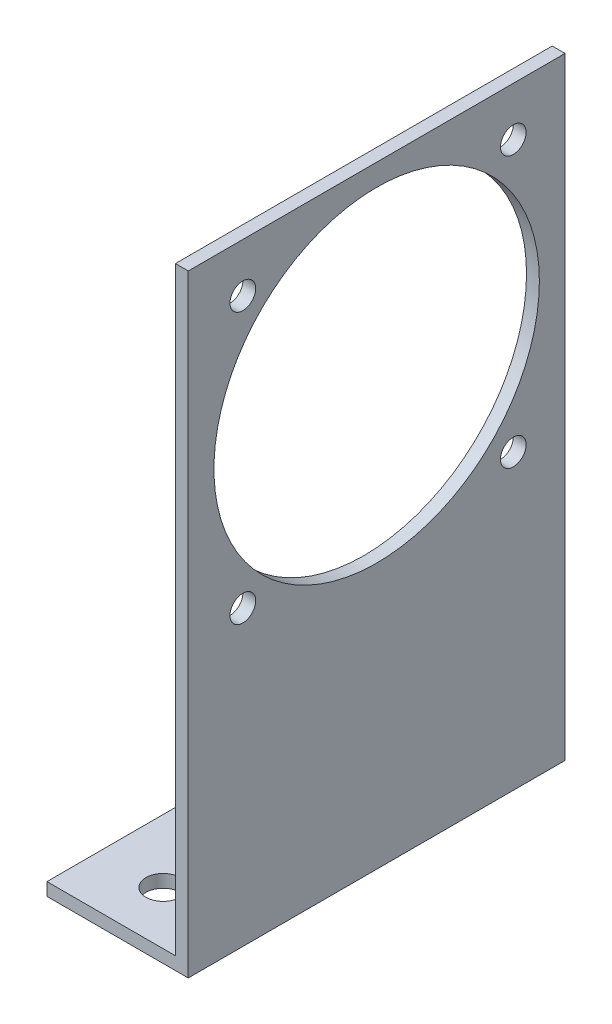
ISO-10303-21;
HEADER;
FILE_DESCRIPTION(('STEP AP214'),'2;1');
FILE_NAME('part.step','',(''),(''),'','','');
FILE_SCHEMA(('AUTOMOTIVE_DESIGN { 1 0 10303 214 1 1 1 1 }'));
ENDSEC;
DATA;
#1=APPLICATION_CONTEXT('core data for automotive mechanical design processes');
#2=APPLICATION_PROTOCOL_DEFINITION('international standard','automotive_design',2000,#1);
#3=PRODUCT_CONTEXT('',#1,'mechanical');
#4=PRODUCT('Part','Part','',(#3));
#5=PRODUCT_RELATED_PRODUCT_CATEGORY('part','',(#4));
#6=PRODUCT_DEFINITION_FORMATION('','',#4);
#7=PRODUCT_DEFINITION_CONTEXT('part definition',#1,'design');
#8=PRODUCT_DEFINITION('design','',#6,#7);
#9=PRODUCT_DEFINITION_SHAPE('','',#8);
#10=(LENGTH_UNIT() NAMED_UNIT(*) SI_UNIT(.MILLI.,.METRE.));
#11=(NAMED_UNIT(*) PLANE_ANGLE_UNIT() SI_UNIT($,.RADIAN.));
#12=(NAMED_UNIT(*) SI_UNIT($,.STERADIAN.) SOLID_ANGLE_UNIT());
#13=UNCERTAINTY_MEASURE_WITH_UNIT(LENGTH_MEASURE(1.E-05),#10,'distance_accuracy_value','');
#14=(GEOMETRIC_REPRESENTATION_CONTEXT(3) GLOBAL_UNCERTAINTY_ASSIGNED_CONTEXT((#13)) GLOBAL_UNIT_ASSIGNED_CONTEXT((#10,
#11,#12)) REPRESENTATION_CONTEXT('',''));
#15=CARTESIAN_POINT('',(0.,0.,0.));
#16=DIRECTION('',(0.,0.,1.));
#17=DIRECTION('',(1.,0.,0.));
#18=AXIS2_PLACEMENT_3D('',#15,#16,#17);
#19=CARTESIAN_POINT('',(16.5,0.,44.));
#20=DIRECTION('',(-1.,0.,0.));
#21=DIRECTION('',(0.,0.,1.));
#22=AXIS2_PLACEMENT_3D('',#19,#20,#21);
#23=PLANE('',#22);
#24=CARTESIAN_POINT('',(16.5,32.7192456794487,6.04403489568548));
#25=DIRECTION('',(1.,0.,0.));
#26=DIRECTION('',(0.,0.,-1.));
#27=AXIS2_PLACEMENT_3D('',#24,#25,#26);
#28=CIRCLE('',#27,1.5);
#29=CARTESIAN_POINT('',(16.5,32.7192456794487,4.54403489568548));
#30=VERTEX_POINT('',#29);
#31=EDGE_CURVE('E157',#30,#30,#28,.T.);
#32=ORIENTED_EDGE('',*,*,#31,.F.);
#33=EDGE_LOOP('',(#32));
#34=FACE_BOUND('',#33,.T.);
#35=CARTESIAN_POINT('',(16.5,32.7192456794487,37.6273925242923));
#36=DIRECTION('',(1.,0.,0.));
#37=DIRECTION('',(0.,0.,-1.));
#38=AXIS2_PLACEMENT_3D('',#35,#36,#37);
#39=CIRCLE('',#38,1.5);
#40=CARTESIAN_POINT('',(16.5,32.7192456794487,36.1273925242923));
#41=VERTEX_POINT('',#40);
#42=EDGE_CURVE('E147',#41,#41,#39,.T.);
#43=ORIENTED_EDGE('',*,*,#42,.F.);
#44=EDGE_LOOP('',(#43));
#45=FACE_BOUND('',#44,.T.);
#46=CARTESIAN_POINT('',(16.5,64.3047188432493,6.04403489568548));
#47=DIRECTION('',(1.,0.,0.));
#48=DIRECTION('',(0.,0.,-1.));
#49=AXIS2_PLACEMENT_3D('',#46,#47,#48);
#50=CIRCLE('',#49,1.5);
#51=CARTESIAN_POINT('',(16.5,64.3047188432493,4.54403489568548));
#52=VERTEX_POINT('',#51);
#53=EDGE_CURVE('E144',#52,#52,#50,.T.);
#54=ORIENTED_EDGE('',*,*,#53,.F.);
#55=EDGE_LOOP('',(#54));
#56=FACE_BOUND('',#55,.T.);
#57=CARTESIAN_POINT('',(16.5,64.3047188432493,37.6273925242923));
#58=DIRECTION('',(1.,0.,0.));
#59=DIRECTION('',(0.,0.,-1.));
#60=AXIS2_PLACEMENT_3D('',#57,#58,#59);
#61=CIRCLE('',#60,1.5);
#62=CARTESIAN_POINT('',(16.5,64.3047188432493,36.1273925242923));
#63=VERTEX_POINT('',#62);
#64=EDGE_CURVE('E141',#63,#63,#61,.T.);
#65=ORIENTED_EDGE('',*,*,#64,.F.);
#66=EDGE_LOOP('',(#65));
#67=FACE_BOUND('',#66,.T.);
#68=CARTESIAN_POINT('',(16.5,48.4593320754999,22.));
#69=DIRECTION('',(1.,0.,0.));
#70=DIRECTION('',(0.,0.,-1.));
#71=AXIS2_PLACEMENT_3D('',#68,#69,#70);
#72=CIRCLE('',#71,19.);
#73=CARTESIAN_POINT('',(16.5,48.4593320754999,3.));
#74=VERTEX_POINT('',#73);
#75=EDGE_CURVE('E136',#74,#74,#72,.T.);
#76=ORIENTED_EDGE('',*,*,#75,.F.);
#77=EDGE_LOOP('',(#76));
#78=FACE_BOUND('',#77,.T.);
#79=DIRECTION('',(0.,1.,0.));
#80=VECTOR('',#79,1.);
#81=CARTESIAN_POINT('',(16.5,0.,0.));
#82=LINE('',#81,#80);
#83=CARTESIAN_POINT('',(16.5,-1.5,0.));
#84=VERTEX_POINT('',#83);
#85=CARTESIAN_POINT('',(16.5,70.,0.));
#86=VERTEX_POINT('',#85);
#87=EDGE_CURVE('E116',#84,#86,#82,.T.);
#88=ORIENTED_EDGE('',*,*,#87,.T.);
#89=DIRECTION('',(0.,0.,-1.));
#90=VECTOR('',#89,1.);
#91=CARTESIAN_POINT('',(16.5,70.,44.));
#92=LINE('',#91,#90);
#93=CARTESIAN_POINT('',(16.5,70.,44.));
#94=VERTEX_POINT('',#93);
#95=EDGE_CURVE('E11',#94,#86,#92,.T.);
#96=ORIENTED_EDGE('',*,*,#95,.F.);
#97=DIRECTION('',(0.,1.,0.));
#98=VECTOR('',#97,1.);
#99=CARTESIAN_POINT('',(16.5,0.,44.));
#100=LINE('',#99,#98);
#101=CARTESIAN_POINT('',(16.5,-1.5,44.));
#102=VERTEX_POINT('',#101);
#103=EDGE_CURVE('E81',#102,#94,#100,.T.);
#104=ORIENTED_EDGE('',*,*,#103,.F.);
#105=DIRECTION('',(0.,0.,-1.));
#106=VECTOR('',#105,1.);
#107=CARTESIAN_POINT('',(16.5,-1.5,44.));
#108=LINE('',#107,#106);
#109=EDGE_CURVE('E112',#102,#84,#108,.T.);
#110=ORIENTED_EDGE('',*,*,#109,.T.);
#111=EDGE_LOOP('',(#88,#96,#104,#110));
#112=FACE_BOUND('',#111,.T.);
#113=ADVANCED_FACE('F33',(#34,#45,#56,#67,#78,#112),#23,.F.);
#114=CARTESIAN_POINT('',(15.,70.,44.));
#115=DIRECTION('',(0.,1.,0.));
#116=DIRECTION('',(0.,0.,1.));
#117=AXIS2_PLACEMENT_3D('',#114,#115,#116);
#118=PLANE('',#117);
#119=DIRECTION('',(1.,0.,0.));
#120=VECTOR('',#119,1.);
#121=CARTESIAN_POINT('',(15.,70.,0.));
#122=LINE('',#121,#120);
#123=CARTESIAN_POINT('',(15.,70.,0.));
#124=VERTEX_POINT('',#123);
#125=EDGE_CURVE('E119',#124,#86,#122,.T.);
#126=ORIENTED_EDGE('',*,*,#125,.F.);
#127=DIRECTION('',(0.,0.,-1.));
#128=VECTOR('',#127,1.);
#129=CARTESIAN_POINT('',(15.,70.,44.));
#130=LINE('',#129,#128);
#131=CARTESIAN_POINT('',(15.,70.,44.));
#132=VERTEX_POINT('',#131);
#133=EDGE_CURVE('E42',#132,#124,#130,.T.);
#134=ORIENTED_EDGE('',*,*,#133,.F.);
#135=DIRECTION('',(1.,0.,0.));
#136=VECTOR('',#135,1.);
#137=CARTESIAN_POINT('',(15.,70.,44.));
#138=LINE('',#137,#136);
#139=EDGE_CURVE('E176',#132,#94,#138,.T.);
#140=ORIENTED_EDGE('',*,*,#139,.T.);
#141=ORIENTED_EDGE('',*,*,#95,.T.);
#142=EDGE_LOOP('',(#126,#134,#140,#141));
#143=FACE_BOUND('',#142,.T.);
#144=ADVANCED_FACE('F199',(#143),#118,.T.);
#145=CARTESIAN_POINT('',(15.,0.,44.));
#146=DIRECTION('',(-1.,0.,0.));
#147=DIRECTION('',(0.,0.,1.));
#148=AXIS2_PLACEMENT_3D('',#145,#146,#147);
#149=PLANE('',#148);
#150=CARTESIAN_POINT('',(15.,32.7192456794487,6.04403489568548));
#151=DIRECTION('',(-1.,0.,0.));
#152=DIRECTION('',(0.,0.,1.));
#153=AXIS2_PLACEMENT_3D('',#150,#151,#152);
#154=CIRCLE('',#153,1.5);
#155=CARTESIAN_POINT('',(15.,32.7192456794487,7.54403489568549));
#156=VERTEX_POINT('',#155);
#157=EDGE_CURVE('E36',#156,#156,#154,.T.);
#158=ORIENTED_EDGE('',*,*,#157,.F.);
#159=EDGE_LOOP('',(#158));
#160=FACE_BOUND('',#159,.T.);
#161=CARTESIAN_POINT('',(15.,32.7192456794487,37.6273925242923));
#162=DIRECTION('',(-1.,0.,0.));
#163=DIRECTION('',(0.,0.,1.));
#164=AXIS2_PLACEMENT_3D('',#161,#162,#163);
#165=CIRCLE('',#164,1.5);
#166=CARTESIAN_POINT('',(15.,32.7192456794487,39.1273925242923));
#167=VERTEX_POINT('',#166);
#168=EDGE_CURVE('E145',#167,#167,#165,.T.);
#169=ORIENTED_EDGE('',*,*,#168,.F.);
#170=EDGE_LOOP('',(#169));
#171=FACE_BOUND('',#170,.T.);
#172=CARTESIAN_POINT('',(15.,64.3047188432493,6.04403489568548));
#173=DIRECTION('',(-1.,0.,0.));
#174=DIRECTION('',(0.,0.,1.));
#175=AXIS2_PLACEMENT_3D('',#172,#173,#174);
#176=CIRCLE('',#175,1.5);
#177=CARTESIAN_POINT('',(15.,64.3047188432493,7.54403489568549));
#178=VERTEX_POINT('',#177);
#179=EDGE_CURVE('E142',#178,#178,#176,.T.);
#180=ORIENTED_EDGE('',*,*,#179,.F.);
#181=EDGE_LOOP('',(#180));
#182=FACE_BOUND('',#181,.T.);
#183=CARTESIAN_POINT('',(15.,64.3047188432493,37.6273925242923));
#184=DIRECTION('',(-1.,0.,0.));
#185=DIRECTION('',(0.,0.,1.));
#186=AXIS2_PLACEMENT_3D('',#183,#184,#185);
#187=CIRCLE('',#186,1.5);
#188=CARTESIAN_POINT('',(15.,64.3047188432493,39.1273925242923));
#189=VERTEX_POINT('',#188);
#190=EDGE_CURVE('E137',#189,#189,#187,.T.);
#191=ORIENTED_EDGE('',*,*,#190,.F.);
#192=EDGE_LOOP('',(#191));
#193=FACE_BOUND('',#192,.T.);
#194=CARTESIAN_POINT('',(15.,48.4593320754999,22.));
#195=DIRECTION('',(-1.,0.,0.));
#196=DIRECTION('',(0.,0.,1.));
#197=AXIS2_PLACEMENT_3D('',#194,#195,#196);
#198=CIRCLE('',#197,19.);
#199=CARTESIAN_POINT('',(15.,48.4593320754999,41.));
#200=VERTEX_POINT('',#199);
#201=EDGE_CURVE('E120',#200,#200,#198,.T.);
#202=ORIENTED_EDGE('',*,*,#201,.F.);
#203=EDGE_LOOP('',(#202));
#204=FACE_BOUND('',#203,.T.);
#205=DIRECTION('',(0.,1.,0.));
#206=VECTOR('',#205,1.);
#207=CARTESIAN_POINT('',(15.,0.,0.));
#208=LINE('',#207,#206);
#209=CARTESIAN_POINT('',(15.,0.,0.));
#210=VERTEX_POINT('',#209);
#211=EDGE_CURVE('E123',#210,#124,#208,.T.);
#212=ORIENTED_EDGE('',*,*,#211,.F.);
#213=DIRECTION('',(0.,0.,-1.));
#214=VECTOR('',#213,1.);
#215=CARTESIAN_POINT('',(15.,0.,44.));
#216=LINE('',#215,#214);
#217=CARTESIAN_POINT('',(15.,0.,44.));
#218=VERTEX_POINT('',#217);
#219=EDGE_CURVE('E102',#218,#210,#216,.T.);
#220=ORIENTED_EDGE('',*,*,#219,.F.);
#221=DIRECTION('',(0.,1.,0.));
#222=VECTOR('',#221,1.);
#223=CARTESIAN_POINT('',(15.,0.,44.));
#224=LINE('',#223,#222);
#225=EDGE_CURVE('E108',#218,#132,#224,.T.);
#226=ORIENTED_EDGE('',*,*,#225,.T.);
#227=ORIENTED_EDGE('',*,*,#133,.T.);
#228=EDGE_LOOP('',(#212,#220,#226,#227));
#229=FACE_BOUND('',#228,.T.);
#230=ADVANCED_FACE('F180',(#160,#171,#182,#193,#204,#229),#149,.T.);
#231=CARTESIAN_POINT('',(0.,0.,44.));
#232=DIRECTION('',(0.,1.,0.));
#233=DIRECTION('',(0.,0.,1.));
#234=AXIS2_PLACEMENT_3D('',#231,#232,#233);
#235=PLANE('',#234);
#236=CARTESIAN_POINT('',(7.37008417365065,0.,37.8086103355978));
#237=DIRECTION('',(0.,1.,0.));
#238=DIRECTION('',(0.,0.,1.));
#239=AXIS2_PLACEMENT_3D('',#236,#237,#238);
#240=CIRCLE('',#239,2.);
#241=CARTESIAN_POINT('',(7.37008417365065,0.,39.8086103355978));
#242=VERTEX_POINT('',#241);
#243=EDGE_CURVE('E140',#242,#242,#240,.T.);
#244=ORIENTED_EDGE('',*,*,#243,.F.);
#245=EDGE_LOOP('',(#244));
#246=FACE_BOUND('',#245,.T.);
#247=CARTESIAN_POINT('',(7.37008417365065,0.,6.19138966440223));
#248=DIRECTION('',(0.,1.,0.));
#249=DIRECTION('',(0.,0.,1.));
#250=AXIS2_PLACEMENT_3D('',#247,#248,#249);
#251=CIRCLE('',#250,2.);
#252=CARTESIAN_POINT('',(7.37008417365065,0.,8.19138966440222));
#253=VERTEX_POINT('',#252);
#254=EDGE_CURVE('E165',#253,#253,#251,.T.);
#255=ORIENTED_EDGE('',*,*,#254,.F.);
#256=EDGE_LOOP('',(#255));
#257=FACE_BOUND('',#256,.T.);
#258=DIRECTION('',(1.,0.,0.));
#259=VECTOR('',#258,1.);
#260=CARTESIAN_POINT('',(0.,0.,0.));
#261=LINE('',#260,#259);
#262=CARTESIAN_POINT('',(0.,0.,0.));
#263=VERTEX_POINT('',#262);
#264=EDGE_CURVE('E97',#263,#210,#261,.T.);
#265=ORIENTED_EDGE('',*,*,#264,.F.);
#266=DIRECTION('',(0.,0.,-1.));
#267=VECTOR('',#266,1.);
#268=CARTESIAN_POINT('',(0.,0.,44.));
#269=LINE('',#268,#267);
#270=CARTESIAN_POINT('',(0.,0.,44.));
#271=VERTEX_POINT('',#270);
#272=EDGE_CURVE('E92',#271,#263,#269,.T.);
#273=ORIENTED_EDGE('',*,*,#272,.F.);
#274=DIRECTION('',(1.,0.,0.));
#275=VECTOR('',#274,1.);
#276=CARTESIAN_POINT('',(0.,0.,44.));
#277=LINE('',#276,#275);
#278=EDGE_CURVE('E95',#271,#218,#277,.T.);
#279=ORIENTED_EDGE('',*,*,#278,.T.);
#280=ORIENTED_EDGE('',*,*,#219,.T.);
#281=EDGE_LOOP('',(#265,#273,#279,#280));
#282=FACE_BOUND('',#281,.T.);
#283=ADVANCED_FACE('F94',(#246,#257,#282),#235,.T.);
#284=CARTESIAN_POINT('',(0.,-1.5,44.));
#285=DIRECTION('',(-1.,0.,0.));
#286=DIRECTION('',(0.,0.,1.));
#287=AXIS2_PLACEMENT_3D('',#284,#285,#286);
#288=PLANE('',#287);
#289=DIRECTION('',(0.,1.,0.));
#290=VECTOR('',#289,1.);
#291=CARTESIAN_POINT('',(0.,-1.5,0.));
#292=LINE('',#291,#290);
#293=CARTESIAN_POINT('',(0.,-1.5,0.));
#294=VERTEX_POINT('',#293);
#295=EDGE_CURVE('E127',#294,#263,#292,.T.);
#296=ORIENTED_EDGE('',*,*,#295,.F.);
#297=DIRECTION('',(0.,0.,-1.));
#298=VECTOR('',#297,1.);
#299=CARTESIAN_POINT('',(0.,-1.5,44.));
#300=LINE('',#299,#298);
#301=CARTESIAN_POINT('',(0.,-1.5,44.));
#302=VERTEX_POINT('',#301);
#303=EDGE_CURVE('E72',#302,#294,#300,.T.);
#304=ORIENTED_EDGE('',*,*,#303,.F.);
#305=DIRECTION('',(0.,1.,0.));
#306=VECTOR('',#305,1.);
#307=CARTESIAN_POINT('',(0.,-1.5,44.));
#308=LINE('',#307,#306);
#309=EDGE_CURVE('E106',#302,#271,#308,.T.);
#310=ORIENTED_EDGE('',*,*,#309,.T.);
#311=ORIENTED_EDGE('',*,*,#272,.T.);
#312=EDGE_LOOP('',(#296,#304,#310,#311));
#313=FACE_BOUND('',#312,.T.);
#314=ADVANCED_FACE('F110',(#313),#288,.T.);
#315=CARTESIAN_POINT('',(0.,-1.5,44.));
#316=DIRECTION('',(0.,1.,0.));
#317=DIRECTION('',(0.,0.,1.));
#318=AXIS2_PLACEMENT_3D('',#315,#316,#317);
#319=PLANE('',#318);
#320=CARTESIAN_POINT('',(7.37008417365065,-1.5,37.8086103355978));
#321=DIRECTION('',(0.,1.,0.));
#322=DIRECTION('',(0.,0.,1.));
#323=AXIS2_PLACEMENT_3D('',#320,#321,#322);
#324=CIRCLE('',#323,2.);
#325=CARTESIAN_POINT('',(7.37008417365065,-1.5,39.8086103355978));
#326=VERTEX_POINT('',#325);
#327=EDGE_CURVE('E162',#326,#326,#324,.T.);
#328=ORIENTED_EDGE('',*,*,#327,.T.);
#329=EDGE_LOOP('',(#328));
#330=FACE_BOUND('',#329,.T.);
#331=CARTESIAN_POINT('',(7.37008417365065,-1.5,6.19138966440223));
#332=DIRECTION('',(0.,1.,0.));
#333=DIRECTION('',(0.,0.,1.));
#334=AXIS2_PLACEMENT_3D('',#331,#332,#333);
#335=CIRCLE('',#334,2.);
#336=CARTESIAN_POINT('',(7.37008417365065,-1.5,8.19138966440222));
#337=VERTEX_POINT('',#336);
#338=EDGE_CURVE('E168',#337,#337,#335,.T.);
#339=ORIENTED_EDGE('',*,*,#338,.T.);
#340=EDGE_LOOP('',(#339));
#341=FACE_BOUND('',#340,.T.);
#342=DIRECTION('',(1.,0.,0.));
#343=VECTOR('',#342,1.);
#344=CARTESIAN_POINT('',(0.,-1.5,0.));
#345=LINE('',#344,#343);
#346=EDGE_CURVE('E75',#294,#84,#345,.T.);
#347=ORIENTED_EDGE('',*,*,#346,.T.);
#348=ORIENTED_EDGE('',*,*,#109,.F.);
#349=DIRECTION('',(1.,0.,0.));
#350=VECTOR('',#349,1.);
#351=CARTESIAN_POINT('',(0.,-1.5,44.));
#352=LINE('',#351,#350);
#353=EDGE_CURVE('E51',#302,#102,#352,.T.);
#354=ORIENTED_EDGE('',*,*,#353,.F.);
#355=ORIENTED_EDGE('',*,*,#303,.T.);
#356=EDGE_LOOP('',(#347,#348,#354,#355));
#357=FACE_BOUND('',#356,.T.);
#358=ADVANCED_FACE('F186',(#330,#341,#357),#319,.F.);
#359=CARTESIAN_POINT('',(0.,0.,44.));
#360=DIRECTION('',(0.,0.,-1.));
#361=DIRECTION('',(-1.,0.,0.));
#362=AXIS2_PLACEMENT_3D('',#359,#360,#361);
#363=PLANE('',#362);
#364=ORIENTED_EDGE('',*,*,#103,.T.);
#365=ORIENTED_EDGE('',*,*,#139,.F.);
#366=ORIENTED_EDGE('',*,*,#225,.F.);
#367=ORIENTED_EDGE('',*,*,#278,.F.);
#368=ORIENTED_EDGE('',*,*,#309,.F.);
#369=ORIENTED_EDGE('',*,*,#353,.T.);
#370=EDGE_LOOP('',(#364,#365,#366,#367,#368,#369));
#371=FACE_BOUND('',#370,.T.);
#372=ADVANCED_FACE('F105',(#371),#363,.F.);
#373=CARTESIAN_POINT('',(0.,0.,0.));
#374=DIRECTION('',(0.,0.,-1.));
#375=DIRECTION('',(-1.,0.,0.));
#376=AXIS2_PLACEMENT_3D('',#373,#374,#375);
#377=PLANE('',#376);
#378=ORIENTED_EDGE('',*,*,#87,.F.);
#379=ORIENTED_EDGE('',*,*,#346,.F.);
#380=ORIENTED_EDGE('',*,*,#295,.T.);
#381=ORIENTED_EDGE('',*,*,#264,.T.);
#382=ORIENTED_EDGE('',*,*,#211,.T.);
#383=ORIENTED_EDGE('',*,*,#125,.T.);
#384=EDGE_LOOP('',(#378,#379,#380,#381,#382,#383));
#385=FACE_BOUND('',#384,.T.);
#386=ADVANCED_FACE('F184',(#385),#377,.T.);
#387=CARTESIAN_POINT('',(0.,48.4593320754999,22.));
#388=DIRECTION('',(1.,0.,0.));
#389=DIRECTION('',(0.,0.,-1.));
#390=AXIS2_PLACEMENT_3D('',#387,#388,#389);
#391=CYLINDRICAL_SURFACE('',#390,19.);
#392=ORIENTED_EDGE('',*,*,#201,.T.);
#393=EDGE_LOOP('',(#392));
#394=FACE_BOUND('',#393,.T.);
#395=ORIENTED_EDGE('',*,*,#75,.T.);
#396=EDGE_LOOP('',(#395));
#397=FACE_BOUND('',#396,.T.);
#398=ADVANCED_FACE('F215',(#394,#397),#391,.F.);
#399=CARTESIAN_POINT('',(7.37008417365065,-1.5,6.19138966440223));
#400=DIRECTION('',(0.,1.,0.));
#401=DIRECTION('',(0.,0.,1.));
#402=AXIS2_PLACEMENT_3D('',#399,#400,#401);
#403=CYLINDRICAL_SURFACE('',#402,2.);
#404=ORIENTED_EDGE('',*,*,#338,.F.);
#405=EDGE_LOOP('',(#404));
#406=FACE_BOUND('',#405,.T.);
#407=ORIENTED_EDGE('',*,*,#254,.T.);
#408=EDGE_LOOP('',(#407));
#409=FACE_BOUND('',#408,.T.);
#410=ADVANCED_FACE('F217',(#406,#409),#403,.F.);
#411=CARTESIAN_POINT('',(7.37008417365065,-1.5,37.8086103355978));
#412=DIRECTION('',(0.,1.,0.));
#413=DIRECTION('',(0.,0.,1.));
#414=AXIS2_PLACEMENT_3D('',#411,#412,#413);
#415=CYLINDRICAL_SURFACE('',#414,2.);
#416=ORIENTED_EDGE('',*,*,#327,.F.);
#417=EDGE_LOOP('',(#416));
#418=FACE_BOUND('',#417,.T.);
#419=ORIENTED_EDGE('',*,*,#243,.T.);
#420=EDGE_LOOP('',(#419));
#421=FACE_BOUND('',#420,.T.);
#422=ADVANCED_FACE('F224',(#418,#421),#415,.F.);
#423=CARTESIAN_POINT('',(0.,64.3047188432493,37.6273925242923));
#424=DIRECTION('',(1.,0.,0.));
#425=DIRECTION('',(0.,0.,-1.));
#426=AXIS2_PLACEMENT_3D('',#423,#424,#425);
#427=CYLINDRICAL_SURFACE('',#426,1.5);
#428=ORIENTED_EDGE('',*,*,#190,.T.);
#429=EDGE_LOOP('',(#428));
#430=FACE_BOUND('',#429,.T.);
#431=ORIENTED_EDGE('',*,*,#64,.T.);
#432=EDGE_LOOP('',(#431));
#433=FACE_BOUND('',#432,.T.);
#434=ADVANCED_FACE('F230',(#430,#433),#427,.F.);
#435=CARTESIAN_POINT('',(0.,64.3047188432493,6.04403489568548));
#436=DIRECTION('',(1.,0.,0.));
#437=DIRECTION('',(0.,0.,-1.));
#438=AXIS2_PLACEMENT_3D('',#435,#436,#437);
#439=CYLINDRICAL_SURFACE('',#438,1.5);
#440=ORIENTED_EDGE('',*,*,#179,.T.);
#441=EDGE_LOOP('',(#440));
#442=FACE_BOUND('',#441,.T.);
#443=ORIENTED_EDGE('',*,*,#53,.T.);
#444=EDGE_LOOP('',(#443));
#445=FACE_BOUND('',#444,.T.);
#446=ADVANCED_FACE('F234',(#442,#445),#439,.F.);
#447=CARTESIAN_POINT('',(0.,32.7192456794487,37.6273925242923));
#448=DIRECTION('',(1.,0.,0.));
#449=DIRECTION('',(0.,0.,-1.));
#450=AXIS2_PLACEMENT_3D('',#447,#448,#449);
#451=CYLINDRICAL_SURFACE('',#450,1.5);
#452=ORIENTED_EDGE('',*,*,#168,.T.);
#453=EDGE_LOOP('',(#452));
#454=FACE_BOUND('',#453,.T.);
#455=ORIENTED_EDGE('',*,*,#42,.T.);
#456=EDGE_LOOP('',(#455));
#457=FACE_BOUND('',#456,.T.);
#458=ADVANCED_FACE('F238',(#454,#457),#451,.F.);
#459=CARTESIAN_POINT('',(0.,32.7192456794487,6.04403489568548));
#460=DIRECTION('',(1.,0.,0.));
#461=DIRECTION('',(0.,0.,-1.));
#462=AXIS2_PLACEMENT_3D('',#459,#460,#461);
#463=CYLINDRICAL_SURFACE('',#462,1.5);
#464=ORIENTED_EDGE('',*,*,#157,.T.);
#465=EDGE_LOOP('',(#464));
#466=FACE_BOUND('',#465,.T.);
#467=ORIENTED_EDGE('',*,*,#31,.T.);
#468=EDGE_LOOP('',(#467));
#469=FACE_BOUND('',#468,.T.);
#470=ADVANCED_FACE('F242',(#466,#469),#463,.F.);
#471=CLOSED_SHELL('',(#113,#144,#230,#283,#314,#358,#372,#386,#398,#410,#422,#434,#446,#458,#470));
#472=MANIFOLD_SOLID_BREP('B2',#471);
#473=ADVANCED_BREP_SHAPE_REPRESENTATION('',(#18,#472),#14);
#474=SHAPE_DEFINITION_REPRESENTATION(#9,#473);
ENDSEC;
END-ISO-10303-21;
